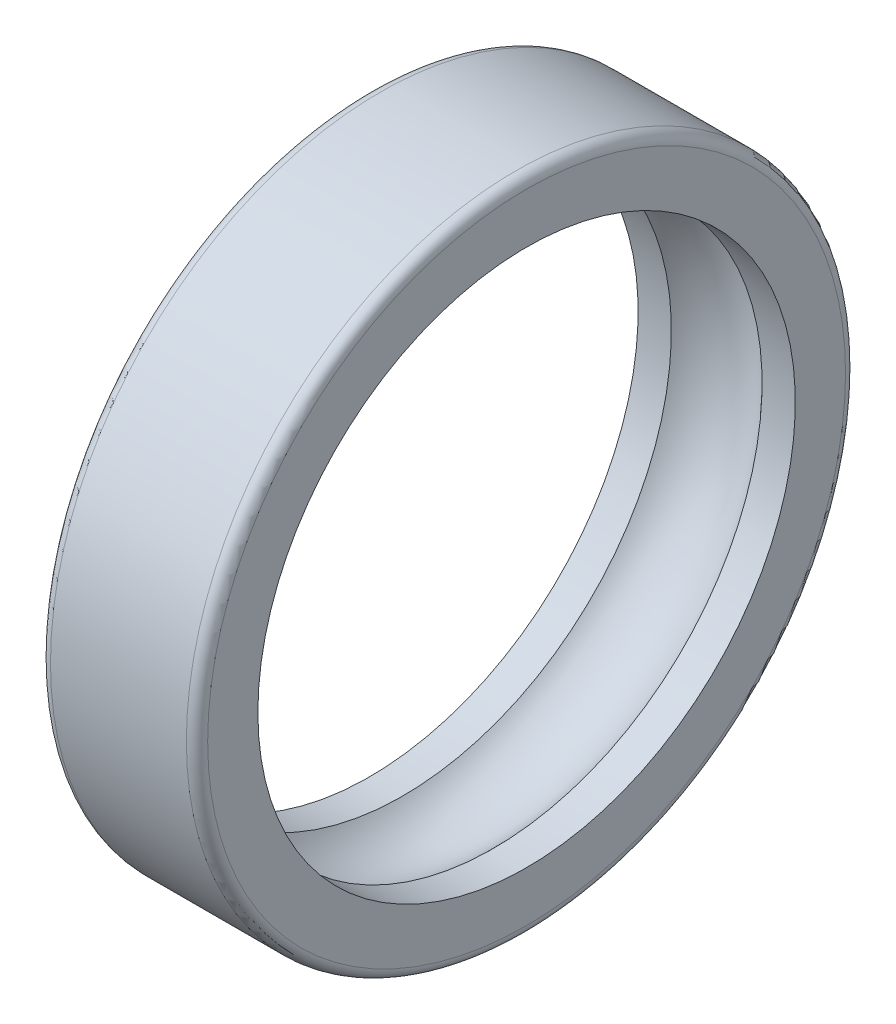
ISO-10303-21;
HEADER;
FILE_DESCRIPTION(('STEP AP214'),'2;1');
FILE_NAME('part.step','',(''),(''),'','','');
FILE_SCHEMA(('AUTOMOTIVE_DESIGN { 1 0 10303 214 1 1 1 1 }'));
ENDSEC;
DATA;
#1=APPLICATION_CONTEXT('core data for automotive mechanical design processes');
#2=APPLICATION_PROTOCOL_DEFINITION('international standard','automotive_design',2000,#1);
#3=PRODUCT_CONTEXT('',#1,'mechanical');
#4=PRODUCT('Part','Part','',(#3));
#5=PRODUCT_RELATED_PRODUCT_CATEGORY('part','',(#4));
#6=PRODUCT_DEFINITION_FORMATION('','',#4);
#7=PRODUCT_DEFINITION_CONTEXT('part definition',#1,'design');
#8=PRODUCT_DEFINITION('design','',#6,#7);
#9=PRODUCT_DEFINITION_SHAPE('','',#8);
#10=(LENGTH_UNIT() NAMED_UNIT(*) SI_UNIT(.MILLI.,.METRE.));
#11=(NAMED_UNIT(*) PLANE_ANGLE_UNIT() SI_UNIT($,.RADIAN.));
#12=(NAMED_UNIT(*) SI_UNIT($,.STERADIAN.) SOLID_ANGLE_UNIT());
#13=UNCERTAINTY_MEASURE_WITH_UNIT(LENGTH_MEASURE(1.E-05),#10,'distance_accuracy_value','');
#14=(GEOMETRIC_REPRESENTATION_CONTEXT(3) GLOBAL_UNCERTAINTY_ASSIGNED_CONTEXT((#13)) GLOBAL_UNIT_ASSIGNED_CONTEXT((#10,
#11,#12)) REPRESENTATION_CONTEXT('',''));
#15=CARTESIAN_POINT('',(0.,0.,0.));
#16=DIRECTION('',(0.,0.,1.));
#17=DIRECTION('',(1.,0.,0.));
#18=AXIS2_PLACEMENT_3D('',#15,#16,#17);
#19=CARTESIAN_POINT('',(-1.65763888888889,0.,0.));
#20=DIRECTION('',(-1.,0.,0.));
#21=DIRECTION('',(0.,0.,1.));
#22=AXIS2_PLACEMENT_3D('',#19,#20,#21);
#23=CYLINDRICAL_SURFACE('',#22,5.3);
#24=CARTESIAN_POINT('',(1.55,0.,0.));
#25=DIRECTION('',(-1.,0.,0.));
#26=DIRECTION('',(0.,0.,1.));
#27=AXIS2_PLACEMENT_3D('',#24,#25,#26);
#28=CIRCLE('',#27,5.3);
#29=CARTESIAN_POINT('',(1.55,0.,5.3));
#30=VERTEX_POINT('',#29);
#31=EDGE_CURVE('E74',#30,#30,#28,.T.);
#32=ORIENTED_EDGE('',*,*,#31,.F.);
#33=EDGE_LOOP('',(#32));
#34=FACE_BOUND('',#33,.T.);
#35=CARTESIAN_POINT('',(0.894427190999916,0.,0.));
#36=DIRECTION('',(-1.,0.,0.));
#37=DIRECTION('',(0.,0.,1.));
#38=AXIS2_PLACEMENT_3D('',#35,#36,#37);
#39=CIRCLE('',#38,5.3);
#40=CARTESIAN_POINT('',(0.894427190999916,0.,5.3));
#41=VERTEX_POINT('',#40);
#42=EDGE_CURVE('E62',#41,#41,#39,.T.);
#43=ORIENTED_EDGE('',*,*,#42,.T.);
#44=EDGE_LOOP('',(#43));
#45=FACE_BOUND('',#44,.T.);
#46=ADVANCED_FACE('F38',(#34,#45),#23,.F.);
#47=CARTESIAN_POINT('',(0.,0.,0.));
#48=DIRECTION('',(-1.,0.,0.));
#49=DIRECTION('',(0.,0.,1.));
#50=AXIS2_PLACEMENT_3D('',#47,#48,#49);
#51=TOROIDAL_SURFACE('',#50,4.5,1.2);
#52=ORIENTED_EDGE('',*,*,#42,.F.);
#53=EDGE_LOOP('',(#52));
#54=FACE_BOUND('',#53,.T.);
#55=CARTESIAN_POINT('',(-0.894427190999916,0.,0.));
#56=DIRECTION('',(-1.,0.,0.));
#57=DIRECTION('',(0.,0.,1.));
#58=AXIS2_PLACEMENT_3D('',#55,#56,#57);
#59=CIRCLE('',#58,5.3);
#60=CARTESIAN_POINT('',(-0.894427190999916,0.,5.3));
#61=VERTEX_POINT('',#60);
#62=EDGE_CURVE('E66',#61,#61,#59,.T.);
#63=ORIENTED_EDGE('',*,*,#62,.T.);
#64=EDGE_LOOP('',(#63));
#65=FACE_BOUND('',#64,.T.);
#66=ADVANCED_FACE('F83',(#54,#65),#51,.F.);
#67=CARTESIAN_POINT('',(-1.65763888888889,0.,0.));
#68=DIRECTION('',(-1.,0.,0.));
#69=DIRECTION('',(0.,0.,1.));
#70=AXIS2_PLACEMENT_3D('',#67,#68,#69);
#71=CYLINDRICAL_SURFACE('',#70,5.3);
#72=ORIENTED_EDGE('',*,*,#62,.F.);
#73=EDGE_LOOP('',(#72));
#74=FACE_BOUND('',#73,.T.);
#75=CARTESIAN_POINT('',(-1.55,0.,0.));
#76=DIRECTION('',(-1.,0.,0.));
#77=DIRECTION('',(0.,0.,1.));
#78=AXIS2_PLACEMENT_3D('',#75,#76,#77);
#79=CIRCLE('',#78,5.3);
#80=CARTESIAN_POINT('',(-1.55,0.,5.3));
#81=VERTEX_POINT('',#80);
#82=EDGE_CURVE('E70',#81,#81,#79,.T.);
#83=ORIENTED_EDGE('',*,*,#82,.T.);
#84=EDGE_LOOP('',(#83));
#85=FACE_BOUND('',#84,.T.);
#86=ADVANCED_FACE('F89',(#74,#85),#71,.F.);
#87=CARTESIAN_POINT('',(-1.55,6.5,0.));
#88=DIRECTION('',(1.,0.,0.));
#89=DIRECTION('',(0.,0.,-1.));
#90=AXIS2_PLACEMENT_3D('',#87,#88,#89);
#91=PLANE('',#90);
#92=CARTESIAN_POINT('',(-1.55,0.,0.));
#93=DIRECTION('',(1.,0.,0.));
#94=DIRECTION('',(0.,0.,-1.));
#95=AXIS2_PLACEMENT_3D('',#92,#93,#94);
#96=CIRCLE('',#95,6.29);
#97=CARTESIAN_POINT('',(-1.55,0.,-6.29));
#98=VERTEX_POINT('',#97);
#99=EDGE_CURVE('E10',#98,#98,#96,.F.);
#100=ORIENTED_EDGE('',*,*,#99,.T.);
#101=EDGE_LOOP('',(#100));
#102=FACE_BOUND('',#101,.T.);
#103=ORIENTED_EDGE('',*,*,#82,.F.);
#104=EDGE_LOOP('',(#103));
#105=FACE_BOUND('',#104,.T.);
#106=ADVANCED_FACE('F95',(#102,#105),#91,.F.);
#107=CARTESIAN_POINT('',(-1.65763888888889,0.,0.));
#108=DIRECTION('',(-1.,0.,0.));
#109=DIRECTION('',(0.,0.,1.));
#110=AXIS2_PLACEMENT_3D('',#107,#108,#109);
#111=CYLINDRICAL_SURFACE('',#110,6.5);
#112=CARTESIAN_POINT('',(1.34,0.,0.));
#113=DIRECTION('',(-1.,0.,0.));
#114=DIRECTION('',(0.,0.,1.));
#115=AXIS2_PLACEMENT_3D('',#112,#113,#114);
#116=CIRCLE('',#115,6.5);
#117=CARTESIAN_POINT('',(1.34,0.,6.5));
#118=VERTEX_POINT('',#117);
#119=EDGE_CURVE('E51',#118,#118,#116,.T.);
#120=ORIENTED_EDGE('',*,*,#119,.T.);
#121=EDGE_LOOP('',(#120));
#122=FACE_BOUND('',#121,.T.);
#123=CARTESIAN_POINT('',(-1.34,0.,0.));
#124=DIRECTION('',(1.,0.,0.));
#125=DIRECTION('',(0.,0.,-1.));
#126=AXIS2_PLACEMENT_3D('',#123,#124,#125);
#127=CIRCLE('',#126,6.5);
#128=CARTESIAN_POINT('',(-1.34,0.,-6.5));
#129=VERTEX_POINT('',#128);
#130=EDGE_CURVE('E56',#129,#129,#127,.T.);
#131=ORIENTED_EDGE('',*,*,#130,.T.);
#132=EDGE_LOOP('',(#131));
#133=FACE_BOUND('',#132,.T.);
#134=ADVANCED_FACE('F100',(#122,#133),#111,.T.);
#135=CARTESIAN_POINT('',(1.55,6.5,0.));
#136=DIRECTION('',(-1.,0.,0.));
#137=DIRECTION('',(0.,0.,1.));
#138=AXIS2_PLACEMENT_3D('',#135,#136,#137);
#139=PLANE('',#138);
#140=CARTESIAN_POINT('',(1.55,0.,0.));
#141=DIRECTION('',(-1.,0.,0.));
#142=DIRECTION('',(0.,0.,1.));
#143=AXIS2_PLACEMENT_3D('',#140,#141,#142);
#144=CIRCLE('',#143,6.29);
#145=CARTESIAN_POINT('',(1.55,0.,6.29));
#146=VERTEX_POINT('',#145);
#147=EDGE_CURVE('E46',#146,#146,#144,.F.);
#148=ORIENTED_EDGE('',*,*,#147,.T.);
#149=EDGE_LOOP('',(#148));
#150=FACE_BOUND('',#149,.T.);
#151=ORIENTED_EDGE('',*,*,#31,.T.);
#152=EDGE_LOOP('',(#151));
#153=FACE_BOUND('',#152,.T.);
#154=ADVANCED_FACE('F79',(#150,#153),#139,.F.);
#155=CARTESIAN_POINT('',(1.34,0.,0.));
#156=DIRECTION('',(-1.,0.,0.));
#157=DIRECTION('',(0.,0.,1.));
#158=AXIS2_PLACEMENT_3D('',#155,#156,#157);
#159=TOROIDAL_SURFACE('',#158,6.29,0.21);
#160=ORIENTED_EDGE('',*,*,#147,.F.);
#161=EDGE_LOOP('',(#160));
#162=FACE_BOUND('',#161,.T.);
#163=ORIENTED_EDGE('',*,*,#119,.F.);
#164=EDGE_LOOP('',(#163));
#165=FACE_BOUND('',#164,.T.);
#166=ADVANCED_FACE('F108',(#162,#165),#159,.T.);
#167=CARTESIAN_POINT('',(-1.34,0.,0.));
#168=DIRECTION('',(1.,0.,0.));
#169=DIRECTION('',(0.,0.,-1.));
#170=AXIS2_PLACEMENT_3D('',#167,#168,#169);
#171=TOROIDAL_SURFACE('',#170,6.29,0.21);
#172=ORIENTED_EDGE('',*,*,#130,.F.);
#173=EDGE_LOOP('',(#172));
#174=FACE_BOUND('',#173,.T.);
#175=ORIENTED_EDGE('',*,*,#99,.F.);
#176=EDGE_LOOP('',(#175));
#177=FACE_BOUND('',#176,.T.);
#178=ADVANCED_FACE('F40',(#174,#177),#171,.T.);
#179=CLOSED_SHELL('',(#46,#66,#86,#106,#134,#154,#166,#178));
#180=MANIFOLD_SOLID_BREP('B2',#179);
#181=ADVANCED_BREP_SHAPE_REPRESENTATION('',(#18,#180),#14);
#182=SHAPE_DEFINITION_REPRESENTATION(#9,#181);
ENDSEC;
END-ISO-10303-21;
